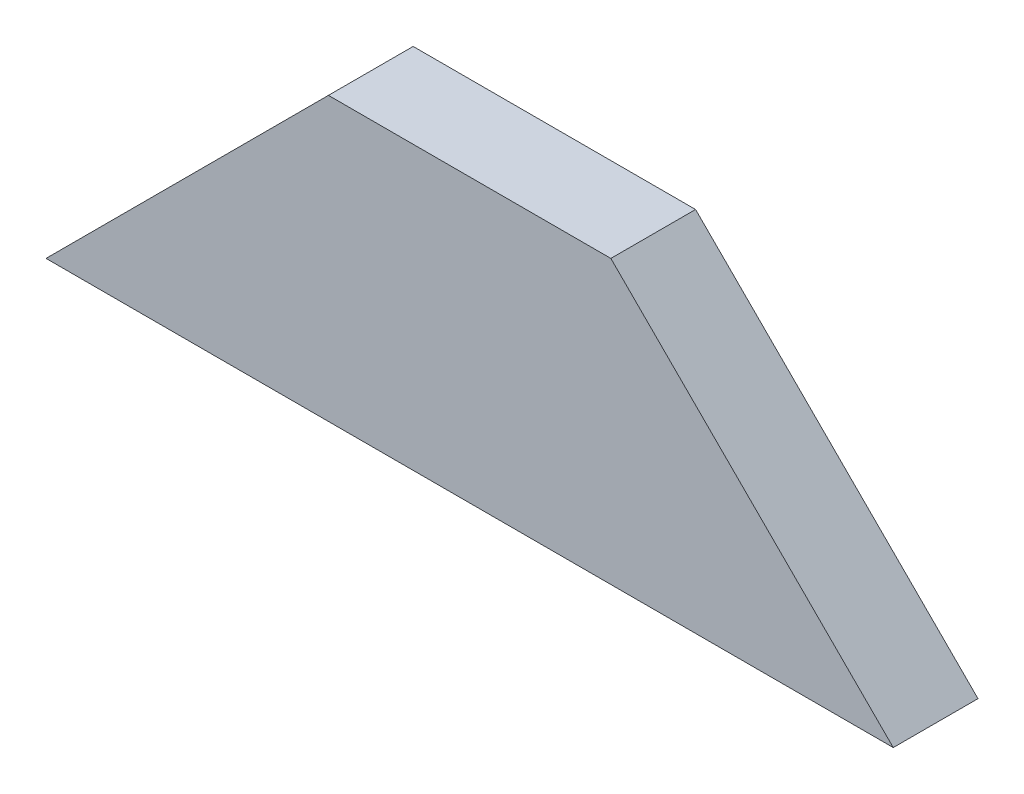
ISO-10303-21;
HEADER;
FILE_DESCRIPTION(('STEP AP214'),'2;1');
FILE_NAME('part.step','',(''),(''),'','','');
FILE_SCHEMA(('AUTOMOTIVE_DESIGN { 1 0 10303 214 1 1 1 1 }'));
ENDSEC;
DATA;
#1=APPLICATION_CONTEXT('core data for automotive mechanical design processes');
#2=APPLICATION_PROTOCOL_DEFINITION('international standard','automotive_design',2000,#1);
#3=PRODUCT_CONTEXT('',#1,'mechanical');
#4=PRODUCT('Part','Part','',(#3));
#5=PRODUCT_RELATED_PRODUCT_CATEGORY('part','',(#4));
#6=PRODUCT_DEFINITION_FORMATION('','',#4);
#7=PRODUCT_DEFINITION_CONTEXT('part definition',#1,'design');
#8=PRODUCT_DEFINITION('design','',#6,#7);
#9=PRODUCT_DEFINITION_SHAPE('','',#8);
#10=(LENGTH_UNIT() NAMED_UNIT(*) SI_UNIT(.MILLI.,.METRE.));
#11=(NAMED_UNIT(*) PLANE_ANGLE_UNIT() SI_UNIT($,.RADIAN.));
#12=(NAMED_UNIT(*) SI_UNIT($,.STERADIAN.) SOLID_ANGLE_UNIT());
#13=UNCERTAINTY_MEASURE_WITH_UNIT(LENGTH_MEASURE(1.E-05),#10,'distance_accuracy_value','');
#14=(GEOMETRIC_REPRESENTATION_CONTEXT(3) GLOBAL_UNCERTAINTY_ASSIGNED_CONTEXT((#13)) GLOBAL_UNIT_ASSIGNED_CONTEXT((#10,
#11,#12)) REPRESENTATION_CONTEXT('',''));
#15=CARTESIAN_POINT('',(0.,0.,0.));
#16=DIRECTION('',(0.,0.,1.));
#17=DIRECTION('',(1.,0.,0.));
#18=AXIS2_PLACEMENT_3D('',#15,#16,#17);
#19=CARTESIAN_POINT('',(30.,0.,3.));
#20=DIRECTION('',(0.,1.,0.));
#21=DIRECTION('',(-1.,0.,0.));
#22=AXIS2_PLACEMENT_3D('',#19,#20,#21);
#23=PLANE('',#22);
#24=DIRECTION('',(1.,0.,0.));
#25=VECTOR('',#24,1.);
#26=CARTESIAN_POINT('',(30.,0.,0.));
#27=LINE('',#26,#25);
#28=CARTESIAN_POINT('',(0.,0.,0.));
#29=VERTEX_POINT('',#28);
#30=CARTESIAN_POINT('',(30.,0.,0.));
#31=VERTEX_POINT('',#30);
#32=EDGE_CURVE('E102',#29,#31,#27,.T.);
#33=ORIENTED_EDGE('',*,*,#32,.T.);
#34=DIRECTION('',(0.,0.,-1.));
#35=VECTOR('',#34,1.);
#36=CARTESIAN_POINT('',(30.,0.,3.));
#37=LINE('',#36,#35);
#38=CARTESIAN_POINT('',(30.,0.,3.));
#39=VERTEX_POINT('',#38);
#40=EDGE_CURVE('E11',#39,#31,#37,.T.);
#41=ORIENTED_EDGE('',*,*,#40,.F.);
#42=DIRECTION('',(1.,0.,0.));
#43=VECTOR('',#42,1.);
#44=CARTESIAN_POINT('',(30.,0.,3.));
#45=LINE('',#44,#43);
#46=CARTESIAN_POINT('',(0.,0.,3.));
#47=VERTEX_POINT('',#46);
#48=EDGE_CURVE('E90',#47,#39,#45,.T.);
#49=ORIENTED_EDGE('',*,*,#48,.F.);
#50=DIRECTION('',(0.,0.,-1.));
#51=VECTOR('',#50,1.);
#52=CARTESIAN_POINT('',(0.,0.,3.));
#53=LINE('',#52,#51);
#54=EDGE_CURVE('E98',#47,#29,#53,.T.);
#55=ORIENTED_EDGE('',*,*,#54,.T.);
#56=EDGE_LOOP('',(#33,#41,#49,#55));
#57=FACE_BOUND('',#56,.T.);
#58=ADVANCED_FACE('F39',(#57),#23,.F.);
#59=CARTESIAN_POINT('',(20.,10.,3.));
#60=DIRECTION('',(-0.707106781186547,-0.707106781186548,0.));
#61=DIRECTION('',(0.707106781186548,-0.707106781186547,0.));
#62=AXIS2_PLACEMENT_3D('',#59,#60,#61);
#63=PLANE('',#62);
#64=DIRECTION('',(-0.707106781186548,0.707106781186547,0.));
#65=VECTOR('',#64,1.);
#66=CARTESIAN_POINT('',(20.,10.,0.));
#67=LINE('',#66,#65);
#68=CARTESIAN_POINT('',(20.,10.,0.));
#69=VERTEX_POINT('',#68);
#70=EDGE_CURVE('E94',#31,#69,#67,.T.);
#71=ORIENTED_EDGE('',*,*,#70,.T.);
#72=DIRECTION('',(0.,0.,-1.));
#73=VECTOR('',#72,1.);
#74=CARTESIAN_POINT('',(20.,10.,3.));
#75=LINE('',#74,#73);
#76=CARTESIAN_POINT('',(20.,10.,3.));
#77=VERTEX_POINT('',#76);
#78=EDGE_CURVE('E47',#77,#69,#75,.T.);
#79=ORIENTED_EDGE('',*,*,#78,.F.);
#80=DIRECTION('',(-0.707106781186548,0.707106781186547,0.));
#81=VECTOR('',#80,1.);
#82=CARTESIAN_POINT('',(20.,10.,3.));
#83=LINE('',#82,#81);
#84=EDGE_CURVE('E85',#39,#77,#83,.T.);
#85=ORIENTED_EDGE('',*,*,#84,.F.);
#86=ORIENTED_EDGE('',*,*,#40,.T.);
#87=EDGE_LOOP('',(#71,#79,#85,#86));
#88=FACE_BOUND('',#87,.T.);
#89=ADVANCED_FACE('F93',(#88),#63,.F.);
#90=CARTESIAN_POINT('',(10.,10.,3.));
#91=DIRECTION('',(0.,-1.,0.));
#92=DIRECTION('',(0.,0.,-1.));
#93=AXIS2_PLACEMENT_3D('',#90,#91,#92);
#94=PLANE('',#93);
#95=DIRECTION('',(-1.,0.,0.));
#96=VECTOR('',#95,1.);
#97=CARTESIAN_POINT('',(10.,10.,0.));
#98=LINE('',#97,#96);
#99=CARTESIAN_POINT('',(10.,10.,0.));
#100=VERTEX_POINT('',#99);
#101=EDGE_CURVE('E72',#69,#100,#98,.T.);
#102=ORIENTED_EDGE('',*,*,#101,.T.);
#103=DIRECTION('',(0.,0.,-1.));
#104=VECTOR('',#103,1.);
#105=CARTESIAN_POINT('',(10.,10.,3.));
#106=LINE('',#105,#104);
#107=CARTESIAN_POINT('',(10.,10.,3.));
#108=VERTEX_POINT('',#107);
#109=EDGE_CURVE('E95',#108,#100,#106,.T.);
#110=ORIENTED_EDGE('',*,*,#109,.F.);
#111=DIRECTION('',(-1.,0.,0.));
#112=VECTOR('',#111,1.);
#113=CARTESIAN_POINT('',(10.,10.,3.));
#114=LINE('',#113,#112);
#115=EDGE_CURVE('E88',#77,#108,#114,.T.);
#116=ORIENTED_EDGE('',*,*,#115,.F.);
#117=ORIENTED_EDGE('',*,*,#78,.T.);
#118=EDGE_LOOP('',(#102,#110,#116,#117));
#119=FACE_BOUND('',#118,.T.);
#120=ADVANCED_FACE('F96',(#119),#94,.F.);
#121=CARTESIAN_POINT('',(0.,0.,3.));
#122=DIRECTION('',(0.707106781186547,-0.707106781186547,0.));
#123=DIRECTION('',(0.707106781186548,0.707106781186548,0.));
#124=AXIS2_PLACEMENT_3D('',#121,#122,#123);
#125=PLANE('',#124);
#126=DIRECTION('',(-0.707106781186548,-0.707106781186548,0.));
#127=VECTOR('',#126,1.);
#128=CARTESIAN_POINT('',(0.,0.,0.));
#129=LINE('',#128,#127);
#130=EDGE_CURVE('E78',#100,#29,#129,.T.);
#131=ORIENTED_EDGE('',*,*,#130,.T.);
#132=ORIENTED_EDGE('',*,*,#54,.F.);
#133=DIRECTION('',(-0.707106781186548,-0.707106781186548,0.));
#134=VECTOR('',#133,1.);
#135=CARTESIAN_POINT('',(0.,0.,3.));
#136=LINE('',#135,#134);
#137=EDGE_CURVE('E55',#108,#47,#136,.T.);
#138=ORIENTED_EDGE('',*,*,#137,.F.);
#139=ORIENTED_EDGE('',*,*,#109,.T.);
#140=EDGE_LOOP('',(#131,#132,#138,#139));
#141=FACE_BOUND('',#140,.T.);
#142=ADVANCED_FACE('F109',(#141),#125,.F.);
#143=CARTESIAN_POINT('',(0.,0.,3.));
#144=DIRECTION('',(0.,0.,-1.));
#145=DIRECTION('',(-1.,0.,0.));
#146=AXIS2_PLACEMENT_3D('',#143,#144,#145);
#147=PLANE('',#146);
#148=ORIENTED_EDGE('',*,*,#48,.T.);
#149=ORIENTED_EDGE('',*,*,#84,.T.);
#150=ORIENTED_EDGE('',*,*,#115,.T.);
#151=ORIENTED_EDGE('',*,*,#137,.T.);
#152=EDGE_LOOP('',(#148,#149,#150,#151));
#153=FACE_BOUND('',#152,.T.);
#154=ADVANCED_FACE('F86',(#153),#147,.F.);
#155=CARTESIAN_POINT('',(0.,0.,0.));
#156=DIRECTION('',(0.,0.,-1.));
#157=DIRECTION('',(-1.,0.,0.));
#158=AXIS2_PLACEMENT_3D('',#155,#156,#157);
#159=PLANE('',#158);
#160=ORIENTED_EDGE('',*,*,#32,.F.);
#161=ORIENTED_EDGE('',*,*,#130,.F.);
#162=ORIENTED_EDGE('',*,*,#101,.F.);
#163=ORIENTED_EDGE('',*,*,#70,.F.);
#164=EDGE_LOOP('',(#160,#161,#162,#163));
#165=FACE_BOUND('',#164,.T.);
#166=ADVANCED_FACE('F112',(#165),#159,.T.);
#167=CLOSED_SHELL('',(#58,#89,#120,#142,#154,#166));
#168=MANIFOLD_SOLID_BREP('B2',#167);
#169=ADVANCED_BREP_SHAPE_REPRESENTATION('',(#18,#168),#14);
#170=SHAPE_DEFINITION_REPRESENTATION(#9,#169);
ENDSEC;
END-ISO-10303-21;
